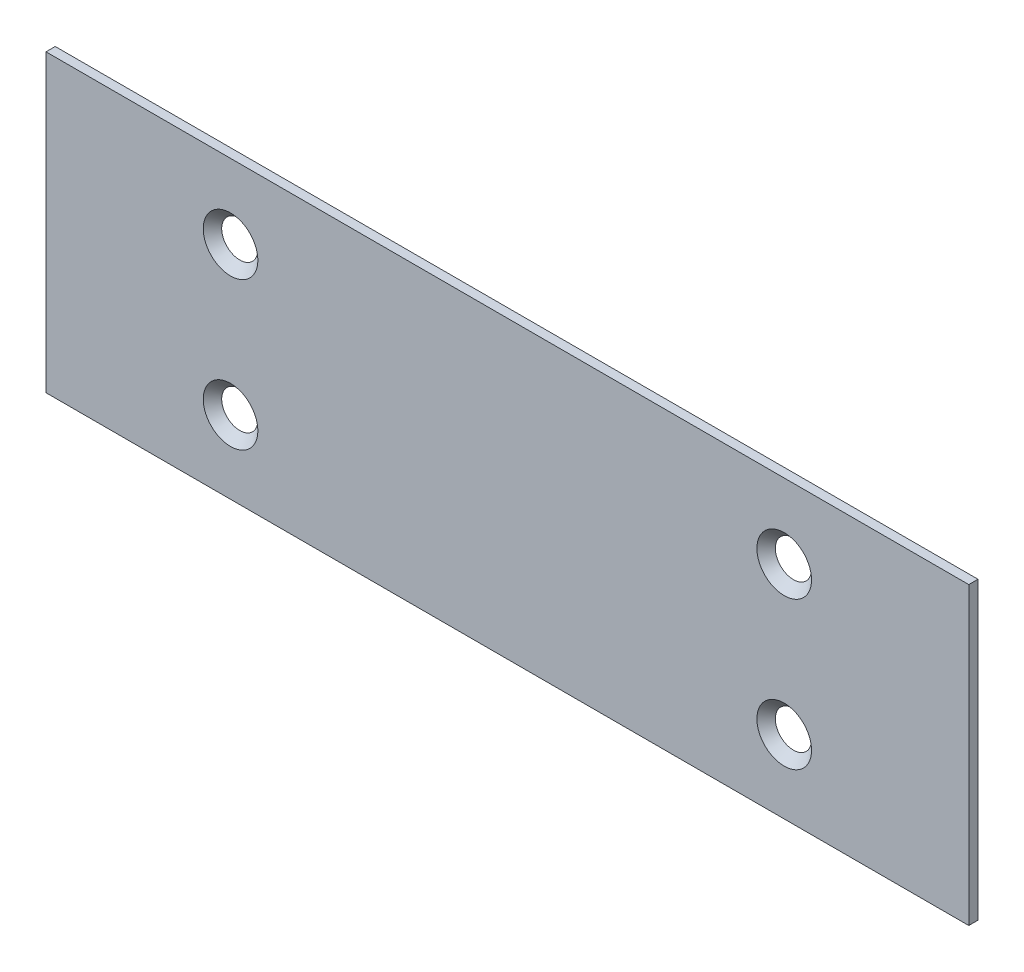
ISO-10303-21;
HEADER;
FILE_DESCRIPTION(('STEP AP214'),'2;1');
FILE_NAME('part.step','',(''),(''),'','','');
FILE_SCHEMA(('AUTOMOTIVE_DESIGN { 1 0 10303 214 1 1 1 1 }'));
ENDSEC;
DATA;
#1=APPLICATION_CONTEXT('core data for automotive mechanical design processes');
#2=APPLICATION_PROTOCOL_DEFINITION('international standard','automotive_design',2000,#1);
#3=PRODUCT_CONTEXT('',#1,'mechanical');
#4=PRODUCT('Part','Part','',(#3));
#5=PRODUCT_RELATED_PRODUCT_CATEGORY('part','',(#4));
#6=PRODUCT_DEFINITION_FORMATION('','',#4);
#7=PRODUCT_DEFINITION_CONTEXT('part definition',#1,'design');
#8=PRODUCT_DEFINITION('design','',#6,#7);
#9=PRODUCT_DEFINITION_SHAPE('','',#8);
#10=(LENGTH_UNIT() NAMED_UNIT(*) SI_UNIT(.MILLI.,.METRE.));
#11=(NAMED_UNIT(*) PLANE_ANGLE_UNIT() SI_UNIT($,.RADIAN.));
#12=(NAMED_UNIT(*) SI_UNIT($,.STERADIAN.) SOLID_ANGLE_UNIT());
#13=UNCERTAINTY_MEASURE_WITH_UNIT(LENGTH_MEASURE(1.E-05),#10,'distance_accuracy_value','');
#14=(GEOMETRIC_REPRESENTATION_CONTEXT(3) GLOBAL_UNCERTAINTY_ASSIGNED_CONTEXT((#13)) GLOBAL_UNIT_ASSIGNED_CONTEXT((#10,
#11,#12)) REPRESENTATION_CONTEXT('',''));
#15=CARTESIAN_POINT('',(0.,0.,0.));
#16=DIRECTION('',(0.,0.,1.));
#17=DIRECTION('',(1.,0.,0.));
#18=AXIS2_PLACEMENT_3D('',#15,#16,#17);
#19=CARTESIAN_POINT('',(0.,0.,1.5875));
#20=DIRECTION('',(-1.,0.,0.));
#21=DIRECTION('',(0.,-1.,0.));
#22=AXIS2_PLACEMENT_3D('',#19,#20,#21);
#23=PLANE('',#22);
#24=DIRECTION('',(0.,1.,0.));
#25=VECTOR('',#24,1.);
#26=CARTESIAN_POINT('',(0.,0.,0.));
#27=LINE('',#26,#25);
#28=CARTESIAN_POINT('',(0.,0.,0.));
#29=VERTEX_POINT('',#28);
#30=CARTESIAN_POINT('',(0.,50.8,0.));
#31=VERTEX_POINT('',#30);
#32=EDGE_CURVE('E101',#29,#31,#27,.T.);
#33=ORIENTED_EDGE('',*,*,#32,.T.);
#34=DIRECTION('',(0.,0.,-1.));
#35=VECTOR('',#34,1.);
#36=CARTESIAN_POINT('',(0.,50.8,1.5875));
#37=LINE('',#36,#35);
#38=CARTESIAN_POINT('',(0.,50.8,1.5875));
#39=VERTEX_POINT('',#38);
#40=EDGE_CURVE('E11',#39,#31,#37,.T.);
#41=ORIENTED_EDGE('',*,*,#40,.F.);
#42=DIRECTION('',(0.,1.,0.));
#43=VECTOR('',#42,1.);
#44=CARTESIAN_POINT('',(0.,0.,1.5875));
#45=LINE('',#44,#43);
#46=CARTESIAN_POINT('',(0.,0.,1.5875));
#47=VERTEX_POINT('',#46);
#48=EDGE_CURVE('E88',#47,#39,#45,.T.);
#49=ORIENTED_EDGE('',*,*,#48,.F.);
#50=DIRECTION('',(0.,0.,-1.));
#51=VECTOR('',#50,1.);
#52=CARTESIAN_POINT('',(0.,0.,1.5875));
#53=LINE('',#52,#51);
#54=EDGE_CURVE('E97',#47,#29,#53,.T.);
#55=ORIENTED_EDGE('',*,*,#54,.T.);
#56=EDGE_LOOP('',(#33,#41,#49,#55));
#57=FACE_BOUND('',#56,.T.);
#58=ADVANCED_FACE('F35',(#57),#23,.F.);
#59=CARTESIAN_POINT('',(0.,50.8,1.5875));
#60=DIRECTION('',(0.,-1.,0.));
#61=DIRECTION('',(1.,0.,0.));
#62=AXIS2_PLACEMENT_3D('',#59,#60,#61);
#63=PLANE('',#62);
#64=DIRECTION('',(-1.,0.,0.));
#65=VECTOR('',#64,1.);
#66=CARTESIAN_POINT('',(0.,50.8,0.));
#67=LINE('',#66,#65);
#68=CARTESIAN_POINT('',(-158.75,50.8,0.));
#69=VERTEX_POINT('',#68);
#70=EDGE_CURVE('E92',#31,#69,#67,.T.);
#71=ORIENTED_EDGE('',*,*,#70,.T.);
#72=DIRECTION('',(0.,0.,-1.));
#73=VECTOR('',#72,1.);
#74=CARTESIAN_POINT('',(-158.75,50.8,1.5875));
#75=LINE('',#74,#73);
#76=CARTESIAN_POINT('',(-158.75,50.8,1.5875));
#77=VERTEX_POINT('',#76);
#78=EDGE_CURVE('E44',#77,#69,#75,.T.);
#79=ORIENTED_EDGE('',*,*,#78,.F.);
#80=DIRECTION('',(-1.,0.,0.));
#81=VECTOR('',#80,1.);
#82=CARTESIAN_POINT('',(0.,50.8,1.5875));
#83=LINE('',#82,#81);
#84=EDGE_CURVE('E83',#39,#77,#83,.T.);
#85=ORIENTED_EDGE('',*,*,#84,.F.);
#86=ORIENTED_EDGE('',*,*,#40,.T.);
#87=EDGE_LOOP('',(#71,#79,#85,#86));
#88=FACE_BOUND('',#87,.T.);
#89=ADVANCED_FACE('F91',(#88),#63,.F.);
#90=CARTESIAN_POINT('',(-158.75,0.,1.5875));
#91=DIRECTION('',(1.,0.,0.));
#92=DIRECTION('',(0.,0.,-1.));
#93=AXIS2_PLACEMENT_3D('',#90,#91,#92);
#94=PLANE('',#93);
#95=DIRECTION('',(0.,-1.,0.));
#96=VECTOR('',#95,1.);
#97=CARTESIAN_POINT('',(-158.75,0.,0.));
#98=LINE('',#97,#96);
#99=CARTESIAN_POINT('',(-158.75,0.,0.));
#100=VERTEX_POINT('',#99);
#101=EDGE_CURVE('E70',#69,#100,#98,.T.);
#102=ORIENTED_EDGE('',*,*,#101,.T.);
#103=DIRECTION('',(0.,0.,-1.));
#104=VECTOR('',#103,1.);
#105=CARTESIAN_POINT('',(-158.75,0.,1.5875));
#106=LINE('',#105,#104);
#107=CARTESIAN_POINT('',(-158.75,0.,1.5875));
#108=VERTEX_POINT('',#107);
#109=EDGE_CURVE('E93',#108,#100,#106,.T.);
#110=ORIENTED_EDGE('',*,*,#109,.F.);
#111=DIRECTION('',(0.,-1.,0.));
#112=VECTOR('',#111,1.);
#113=CARTESIAN_POINT('',(-158.75,0.,1.5875));
#114=LINE('',#113,#112);
#115=EDGE_CURVE('E86',#77,#108,#114,.T.);
#116=ORIENTED_EDGE('',*,*,#115,.F.);
#117=ORIENTED_EDGE('',*,*,#78,.T.);
#118=EDGE_LOOP('',(#102,#110,#116,#117));
#119=FACE_BOUND('',#118,.T.);
#120=ADVANCED_FACE('F95',(#119),#94,.F.);
#121=CARTESIAN_POINT('',(0.,0.,1.5875));
#122=DIRECTION('',(0.,1.,0.));
#123=DIRECTION('',(-1.,0.,0.));
#124=AXIS2_PLACEMENT_3D('',#121,#122,#123);
#125=PLANE('',#124);
#126=DIRECTION('',(1.,0.,0.));
#127=VECTOR('',#126,1.);
#128=CARTESIAN_POINT('',(0.,0.,0.));
#129=LINE('',#128,#127);
#130=EDGE_CURVE('E76',#100,#29,#129,.T.);
#131=ORIENTED_EDGE('',*,*,#130,.T.);
#132=ORIENTED_EDGE('',*,*,#54,.F.);
#133=DIRECTION('',(1.,0.,0.));
#134=VECTOR('',#133,1.);
#135=CARTESIAN_POINT('',(0.,0.,1.5875));
#136=LINE('',#135,#134);
#137=EDGE_CURVE('E53',#108,#47,#136,.T.);
#138=ORIENTED_EDGE('',*,*,#137,.F.);
#139=ORIENTED_EDGE('',*,*,#109,.T.);
#140=EDGE_LOOP('',(#131,#132,#138,#139));
#141=FACE_BOUND('',#140,.T.);
#142=ADVANCED_FACE('F139',(#141),#125,.F.);
#143=CARTESIAN_POINT('',(0.,0.,1.5875));
#144=DIRECTION('',(0.,0.,1.));
#145=DIRECTION('',(1.,0.,0.));
#146=AXIS2_PLACEMENT_3D('',#143,#144,#145);
#147=PLANE('',#146);
#148=CARTESIAN_POINT('',(-127.,37.973,1.5875));
#149=DIRECTION('',(0.,0.,1.));
#150=DIRECTION('',(1.,0.,0.));
#151=AXIS2_PLACEMENT_3D('',#148,#149,#150);
#152=CIRCLE('',#151,4.7);
#153=CARTESIAN_POINT('',(-122.3,37.973,1.5875));
#154=VERTEX_POINT('',#153);
#155=EDGE_CURVE('E128',#154,#154,#152,.T.);
#156=ORIENTED_EDGE('',*,*,#155,.F.);
#157=EDGE_LOOP('',(#156));
#158=FACE_BOUND('',#157,.T.);
#159=CARTESIAN_POINT('',(-127.,12.573,1.5875));
#160=DIRECTION('',(0.,0.,1.));
#161=DIRECTION('',(1.,0.,0.));
#162=AXIS2_PLACEMENT_3D('',#159,#160,#161);
#163=CIRCLE('',#162,4.7);
#164=CARTESIAN_POINT('',(-122.3,12.573,1.5875));
#165=VERTEX_POINT('',#164);
#166=EDGE_CURVE('E118',#165,#165,#163,.T.);
#167=ORIENTED_EDGE('',*,*,#166,.F.);
#168=EDGE_LOOP('',(#167));
#169=FACE_BOUND('',#168,.T.);
#170=CARTESIAN_POINT('',(-31.75,12.573,1.5875));
#171=DIRECTION('',(0.,0.,1.));
#172=DIRECTION('',(1.,0.,0.));
#173=AXIS2_PLACEMENT_3D('',#170,#171,#172);
#174=CIRCLE('',#173,4.7);
#175=CARTESIAN_POINT('',(-27.05,12.573,1.5875));
#176=VERTEX_POINT('',#175);
#177=EDGE_CURVE('E115',#176,#176,#174,.T.);
#178=ORIENTED_EDGE('',*,*,#177,.F.);
#179=EDGE_LOOP('',(#178));
#180=FACE_BOUND('',#179,.T.);
#181=CARTESIAN_POINT('',(-31.75,37.973,1.5875));
#182=DIRECTION('',(0.,0.,1.));
#183=DIRECTION('',(1.,0.,0.));
#184=AXIS2_PLACEMENT_3D('',#181,#182,#183);
#185=CIRCLE('',#184,4.7);
#186=CARTESIAN_POINT('',(-27.05,37.973,1.5875));
#187=VERTEX_POINT('',#186);
#188=EDGE_CURVE('E112',#187,#187,#185,.T.);
#189=ORIENTED_EDGE('',*,*,#188,.F.);
#190=EDGE_LOOP('',(#189));
#191=FACE_BOUND('',#190,.T.);
#192=ORIENTED_EDGE('',*,*,#48,.T.);
#193=ORIENTED_EDGE('',*,*,#84,.T.);
#194=ORIENTED_EDGE('',*,*,#115,.T.);
#195=ORIENTED_EDGE('',*,*,#137,.T.);
#196=EDGE_LOOP('',(#192,#193,#194,#195));
#197=FACE_BOUND('',#196,.T.);
#198=ADVANCED_FACE('F84',(#158,#169,#180,#191,#197),#147,.T.);
#199=CARTESIAN_POINT('',(0.,0.,0.));
#200=DIRECTION('',(0.,0.,1.));
#201=DIRECTION('',(1.,0.,0.));
#202=AXIS2_PLACEMENT_3D('',#199,#200,#201);
#203=PLANE('',#202);
#204=CARTESIAN_POINT('',(-127.,37.973,0.));
#205=DIRECTION('',(0.,0.,1.));
#206=DIRECTION('',(1.,0.,0.));
#207=AXIS2_PLACEMENT_3D('',#204,#205,#206);
#208=CIRCLE('',#207,3.1125);
#209=CARTESIAN_POINT('',(-123.8875,37.973,0.));
#210=VERTEX_POINT('',#209);
#211=EDGE_CURVE('E38',#210,#210,#208,.T.);
#212=ORIENTED_EDGE('',*,*,#211,.T.);
#213=EDGE_LOOP('',(#212));
#214=FACE_BOUND('',#213,.T.);
#215=CARTESIAN_POINT('',(-127.,12.573,0.));
#216=DIRECTION('',(0.,0.,1.));
#217=DIRECTION('',(1.,0.,0.));
#218=AXIS2_PLACEMENT_3D('',#215,#216,#217);
#219=CIRCLE('',#218,3.1125);
#220=CARTESIAN_POINT('',(-123.8875,12.573,0.));
#221=VERTEX_POINT('',#220);
#222=EDGE_CURVE('E116',#221,#221,#219,.T.);
#223=ORIENTED_EDGE('',*,*,#222,.T.);
#224=EDGE_LOOP('',(#223));
#225=FACE_BOUND('',#224,.T.);
#226=CARTESIAN_POINT('',(-31.75,12.573,0.));
#227=DIRECTION('',(0.,0.,1.));
#228=DIRECTION('',(1.,0.,0.));
#229=AXIS2_PLACEMENT_3D('',#226,#227,#228);
#230=CIRCLE('',#229,3.1125);
#231=CARTESIAN_POINT('',(-28.6375,12.573,0.));
#232=VERTEX_POINT('',#231);
#233=EDGE_CURVE('E113',#232,#232,#230,.T.);
#234=ORIENTED_EDGE('',*,*,#233,.T.);
#235=EDGE_LOOP('',(#234));
#236=FACE_BOUND('',#235,.T.);
#237=CARTESIAN_POINT('',(-31.75,37.973,0.));
#238=DIRECTION('',(0.,0.,1.));
#239=DIRECTION('',(1.,0.,0.));
#240=AXIS2_PLACEMENT_3D('',#237,#238,#239);
#241=CIRCLE('',#240,3.1125);
#242=CARTESIAN_POINT('',(-28.6375,37.973,0.));
#243=VERTEX_POINT('',#242);
#244=EDGE_CURVE('E104',#243,#243,#241,.T.);
#245=ORIENTED_EDGE('',*,*,#244,.T.);
#246=EDGE_LOOP('',(#245));
#247=FACE_BOUND('',#246,.T.);
#248=ORIENTED_EDGE('',*,*,#32,.F.);
#249=ORIENTED_EDGE('',*,*,#130,.F.);
#250=ORIENTED_EDGE('',*,*,#101,.F.);
#251=ORIENTED_EDGE('',*,*,#70,.F.);
#252=EDGE_LOOP('',(#248,#249,#250,#251));
#253=FACE_BOUND('',#252,.T.);
#254=ADVANCED_FACE('F138',(#214,#225,#236,#247,#253),#203,.F.);
#255=CARTESIAN_POINT('',(-31.75,37.973,1.5875));
#256=DIRECTION('',(0.,0.,1.));
#257=DIRECTION('',(1.,0.,0.));
#258=AXIS2_PLACEMENT_3D('',#255,#256,#257);
#259=CONICAL_SURFACE('',#258,4.7,0.785398163397449);
#260=ORIENTED_EDGE('',*,*,#188,.T.);
#261=EDGE_LOOP('',(#260));
#262=FACE_BOUND('',#261,.T.);
#263=ORIENTED_EDGE('',*,*,#244,.F.);
#264=EDGE_LOOP('',(#263));
#265=FACE_BOUND('',#264,.T.);
#266=ADVANCED_FACE('F134',(#262,#265),#259,.F.);
#267=CARTESIAN_POINT('',(-31.75,12.573,1.5875));
#268=DIRECTION('',(0.,0.,1.));
#269=DIRECTION('',(1.,0.,0.));
#270=AXIS2_PLACEMENT_3D('',#267,#268,#269);
#271=CONICAL_SURFACE('',#270,4.7,0.785398163397449);
#272=ORIENTED_EDGE('',*,*,#177,.T.);
#273=EDGE_LOOP('',(#272));
#274=FACE_BOUND('',#273,.T.);
#275=ORIENTED_EDGE('',*,*,#233,.F.);
#276=EDGE_LOOP('',(#275));
#277=FACE_BOUND('',#276,.T.);
#278=ADVANCED_FACE('F188',(#274,#277),#271,.F.);
#279=CARTESIAN_POINT('',(-127.,12.573,1.5875));
#280=DIRECTION('',(0.,0.,1.));
#281=DIRECTION('',(1.,0.,0.));
#282=AXIS2_PLACEMENT_3D('',#279,#280,#281);
#283=CONICAL_SURFACE('',#282,4.7,0.785398163397448);
#284=ORIENTED_EDGE('',*,*,#166,.T.);
#285=EDGE_LOOP('',(#284));
#286=FACE_BOUND('',#285,.T.);
#287=ORIENTED_EDGE('',*,*,#222,.F.);
#288=EDGE_LOOP('',(#287));
#289=FACE_BOUND('',#288,.T.);
#290=ADVANCED_FACE('F196',(#286,#289),#283,.F.);
#291=CARTESIAN_POINT('',(-127.,37.973,1.5875));
#292=DIRECTION('',(0.,0.,1.));
#293=DIRECTION('',(1.,0.,0.));
#294=AXIS2_PLACEMENT_3D('',#291,#292,#293);
#295=CONICAL_SURFACE('',#294,4.7,0.785398163397448);
#296=ORIENTED_EDGE('',*,*,#155,.T.);
#297=EDGE_LOOP('',(#296));
#298=FACE_BOUND('',#297,.T.);
#299=ORIENTED_EDGE('',*,*,#211,.F.);
#300=EDGE_LOOP('',(#299));
#301=FACE_BOUND('',#300,.T.);
#302=ADVANCED_FACE('F206',(#298,#301),#295,.F.);
#303=CLOSED_SHELL('',(#58,#89,#120,#142,#198,#254,#266,#278,#290,#302));
#304=MANIFOLD_SOLID_BREP('B2',#303);
#305=ADVANCED_BREP_SHAPE_REPRESENTATION('',(#18,#304),#14);
#306=SHAPE_DEFINITION_REPRESENTATION(#9,#305);
ENDSEC;
END-ISO-10303-21;
